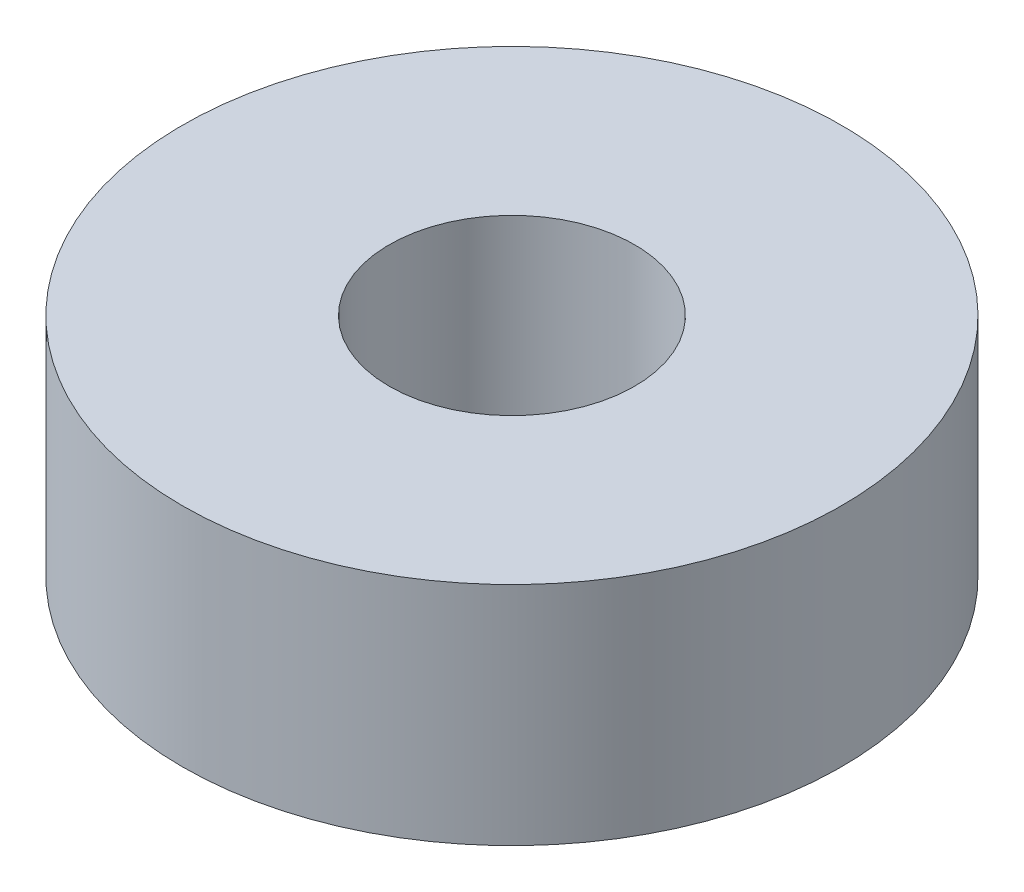
ISO-10303-21;
HEADER;
FILE_DESCRIPTION(('STEP AP214'),'2;1');
FILE_NAME('part.step','',(''),(''),'','','');
FILE_SCHEMA(('AUTOMOTIVE_DESIGN { 1 0 10303 214 1 1 1 1 }'));
ENDSEC;
DATA;
#1=APPLICATION_CONTEXT('core data for automotive mechanical design processes');
#2=APPLICATION_PROTOCOL_DEFINITION('international standard','automotive_design',2000,#1);
#3=PRODUCT_CONTEXT('',#1,'mechanical');
#4=PRODUCT('Part','Part','',(#3));
#5=PRODUCT_RELATED_PRODUCT_CATEGORY('part','',(#4));
#6=PRODUCT_DEFINITION_FORMATION('','',#4);
#7=PRODUCT_DEFINITION_CONTEXT('part definition',#1,'design');
#8=PRODUCT_DEFINITION('design','',#6,#7);
#9=PRODUCT_DEFINITION_SHAPE('','',#8);
#10=(LENGTH_UNIT() NAMED_UNIT(*) SI_UNIT(.MILLI.,.METRE.));
#11=(NAMED_UNIT(*) PLANE_ANGLE_UNIT() SI_UNIT($,.RADIAN.));
#12=(NAMED_UNIT(*) SI_UNIT($,.STERADIAN.) SOLID_ANGLE_UNIT());
#13=UNCERTAINTY_MEASURE_WITH_UNIT(LENGTH_MEASURE(1.E-05),#10,'distance_accuracy_value','');
#14=(GEOMETRIC_REPRESENTATION_CONTEXT(3) GLOBAL_UNCERTAINTY_ASSIGNED_CONTEXT((#13)) GLOBAL_UNIT_ASSIGNED_CONTEXT((#10,
#11,#12)) REPRESENTATION_CONTEXT('',''));
#15=CARTESIAN_POINT('',(0.,0.,0.));
#16=DIRECTION('',(0.,0.,1.));
#17=DIRECTION('',(1.,0.,0.));
#18=AXIS2_PLACEMENT_3D('',#15,#16,#17);
#19=CARTESIAN_POINT('',(0.,4.7,0.));
#20=DIRECTION('',(0.,1.,0.));
#21=DIRECTION('',(0.,0.,1.));
#22=AXIS2_PLACEMENT_3D('',#19,#20,#21);
#23=PLANE('',#22);
#24=CARTESIAN_POINT('',(0.,4.7,0.));
#25=DIRECTION('',(0.,1.,0.));
#26=DIRECTION('',(0.,0.,1.));
#27=AXIS2_PLACEMENT_3D('',#24,#25,#26);
#28=CIRCLE('',#27,6.85);
#29=CARTESIAN_POINT('',(0.,4.7,6.85));
#30=VERTEX_POINT('',#29);
#31=EDGE_CURVE('E10',#30,#30,#28,.T.);
#32=ORIENTED_EDGE('',*,*,#31,.T.);
#33=EDGE_LOOP('',(#32));
#34=FACE_BOUND('',#33,.T.);
#35=CARTESIAN_POINT('',(0.,4.7,0.));
#36=DIRECTION('',(0.,1.,0.));
#37=DIRECTION('',(0.,0.,1.));
#38=AXIS2_PLACEMENT_3D('',#35,#36,#37);
#39=CIRCLE('',#38,2.55);
#40=CARTESIAN_POINT('',(0.,4.7,2.55));
#41=VERTEX_POINT('',#40);
#42=EDGE_CURVE('E46',#41,#41,#39,.T.);
#43=ORIENTED_EDGE('',*,*,#42,.F.);
#44=EDGE_LOOP('',(#43));
#45=FACE_BOUND('',#44,.T.);
#46=ADVANCED_FACE('F35',(#34,#45),#23,.T.);
#47=CARTESIAN_POINT('',(0.,0.,0.));
#48=DIRECTION('',(0.,1.,0.));
#49=DIRECTION('',(0.,0.,1.));
#50=AXIS2_PLACEMENT_3D('',#47,#48,#49);
#51=PLANE('',#50);
#52=CARTESIAN_POINT('',(0.,0.,0.));
#53=DIRECTION('',(0.,1.,0.));
#54=DIRECTION('',(0.,0.,1.));
#55=AXIS2_PLACEMENT_3D('',#52,#53,#54);
#56=CIRCLE('',#55,6.85);
#57=CARTESIAN_POINT('',(0.,0.,6.85));
#58=VERTEX_POINT('',#57);
#59=EDGE_CURVE('E39',#58,#58,#56,.T.);
#60=ORIENTED_EDGE('',*,*,#59,.F.);
#61=EDGE_LOOP('',(#60));
#62=FACE_BOUND('',#61,.T.);
#63=CARTESIAN_POINT('',(0.,0.,0.));
#64=DIRECTION('',(0.,1.,0.));
#65=DIRECTION('',(0.,0.,1.));
#66=AXIS2_PLACEMENT_3D('',#63,#64,#65);
#67=CIRCLE('',#66,2.55);
#68=CARTESIAN_POINT('',(0.,0.,2.55));
#69=VERTEX_POINT('',#68);
#70=EDGE_CURVE('E48',#69,#69,#67,.T.);
#71=ORIENTED_EDGE('',*,*,#70,.T.);
#72=EDGE_LOOP('',(#71));
#73=FACE_BOUND('',#72,.T.);
#74=ADVANCED_FACE('F58',(#62,#73),#51,.F.);
#75=CARTESIAN_POINT('',(0.,4.7,0.));
#76=DIRECTION('',(0.,-1.,0.));
#77=DIRECTION('',(0.,0.,-1.));
#78=AXIS2_PLACEMENT_3D('',#75,#76,#77);
#79=CYLINDRICAL_SURFACE('',#78,6.85);
#80=ORIENTED_EDGE('',*,*,#31,.F.);
#81=EDGE_LOOP('',(#80));
#82=FACE_BOUND('',#81,.T.);
#83=ORIENTED_EDGE('',*,*,#59,.T.);
#84=EDGE_LOOP('',(#83));
#85=FACE_BOUND('',#84,.T.);
#86=ADVANCED_FACE('F37',(#82,#85),#79,.T.);
#87=CARTESIAN_POINT('',(0.,4.7,0.));
#88=DIRECTION('',(0.,-1.,0.));
#89=DIRECTION('',(0.,0.,-1.));
#90=AXIS2_PLACEMENT_3D('',#87,#88,#89);
#91=CYLINDRICAL_SURFACE('',#90,2.55);
#92=ORIENTED_EDGE('',*,*,#42,.T.);
#93=EDGE_LOOP('',(#92));
#94=FACE_BOUND('',#93,.T.);
#95=ORIENTED_EDGE('',*,*,#70,.F.);
#96=EDGE_LOOP('',(#95));
#97=FACE_BOUND('',#96,.T.);
#98=ADVANCED_FACE('F54',(#94,#97),#91,.F.);
#99=CLOSED_SHELL('',(#46,#74,#86,#98));
#100=MANIFOLD_SOLID_BREP('B2',#99);
#101=ADVANCED_BREP_SHAPE_REPRESENTATION('',(#18,#100),#14);
#102=SHAPE_DEFINITION_REPRESENTATION(#9,#101);
ENDSEC;
END-ISO-10303-21;
